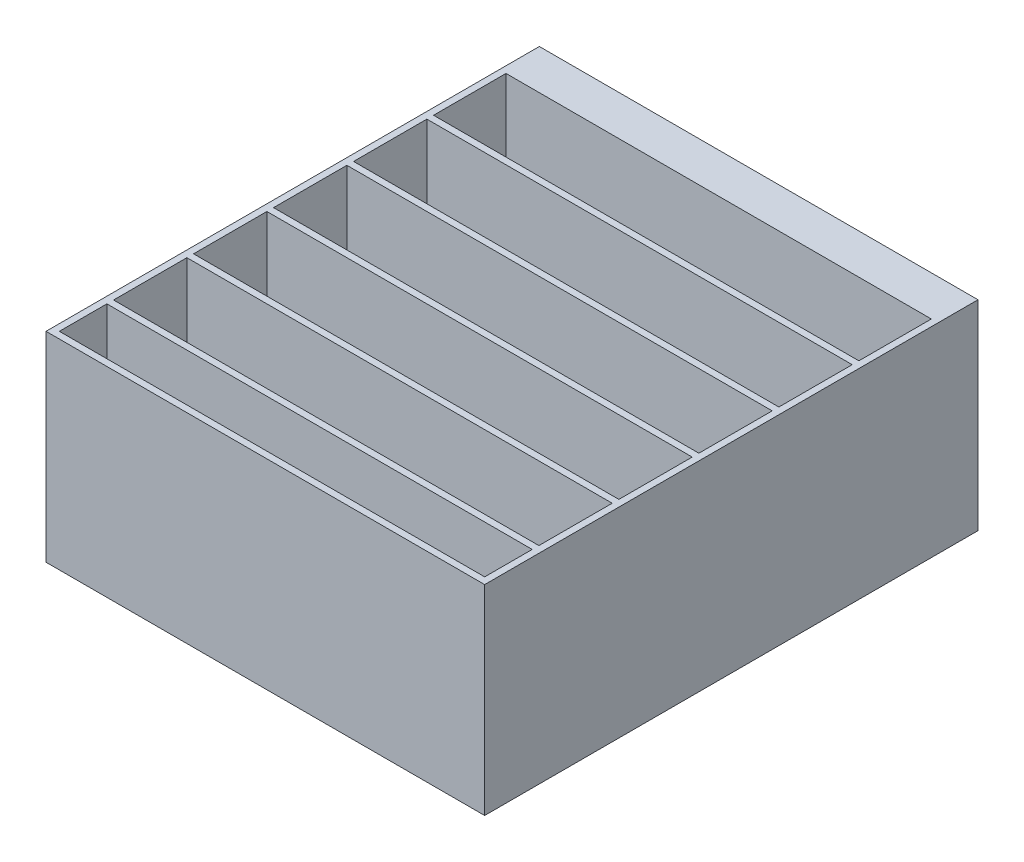
ISO-10303-21;
HEADER;
FILE_DESCRIPTION(('STEP AP214'),'2;1');
FILE_NAME('part.step','',(''),(''),'','','');
FILE_SCHEMA(('AUTOMOTIVE_DESIGN { 1 0 10303 214 1 1 1 1 }'));
ENDSEC;
DATA;
#1=APPLICATION_CONTEXT('core data for automotive mechanical design processes');
#2=APPLICATION_PROTOCOL_DEFINITION('international standard','automotive_design',2000,#1);
#3=PRODUCT_CONTEXT('',#1,'mechanical');
#4=PRODUCT('Part','Part','',(#3));
#5=PRODUCT_RELATED_PRODUCT_CATEGORY('part','',(#4));
#6=PRODUCT_DEFINITION_FORMATION('','',#4);
#7=PRODUCT_DEFINITION_CONTEXT('part definition',#1,'design');
#8=PRODUCT_DEFINITION('design','',#6,#7);
#9=PRODUCT_DEFINITION_SHAPE('','',#8);
#10=(LENGTH_UNIT() NAMED_UNIT(*) SI_UNIT(.MILLI.,.METRE.));
#11=(NAMED_UNIT(*) PLANE_ANGLE_UNIT() SI_UNIT($,.RADIAN.));
#12=(NAMED_UNIT(*) SI_UNIT($,.STERADIAN.) SOLID_ANGLE_UNIT());
#13=UNCERTAINTY_MEASURE_WITH_UNIT(LENGTH_MEASURE(1.E-05),#10,'distance_accuracy_value','');
#14=(GEOMETRIC_REPRESENTATION_CONTEXT(3) GLOBAL_UNCERTAINTY_ASSIGNED_CONTEXT((#13)) GLOBAL_UNIT_ASSIGNED_CONTEXT((#10,
#11,#12)) REPRESENTATION_CONTEXT('',''));
#15=CARTESIAN_POINT('',(0.,0.,0.));
#16=DIRECTION('',(0.,0.,1.));
#17=DIRECTION('',(1.,0.,0.));
#18=AXIS2_PLACEMENT_3D('',#15,#16,#17);
#19=CARTESIAN_POINT('',(-103.678343949045,-66.7595541401274,30.));
#20=DIRECTION('',(-1.,0.,0.));
#21=DIRECTION('',(0.,0.,1.));
#22=AXIS2_PLACEMENT_3D('',#19,#20,#21);
#23=PLANE('',#22);
#24=DIRECTION('',(0.,0.,1.));
#25=VECTOR('',#24,1.);
#26=CARTESIAN_POINT('',(-103.678343949045,-66.7595541401274,30.));
#27=LINE('',#26,#25);
#28=CARTESIAN_POINT('',(-103.678343949045,-66.7595541401274,329.339910945855));
#29=VERTEX_POINT('',#28);
#30=CARTESIAN_POINT('',(-103.678343949045,-66.7595541401274,365.));
#31=VERTEX_POINT('',#30);
#32=EDGE_CURVE('E285',#29,#31,#27,.T.);
#33=ORIENTED_EDGE('',*,*,#32,.F.);
#34=DIRECTION('',(0.,1.,0.));
#35=VECTOR('',#34,1.);
#36=CARTESIAN_POINT('',(-103.678343949045,-66.7595541401274,329.339910945855));
#37=LINE('',#36,#35);
#38=CARTESIAN_POINT('',(-103.678343949045,23.2404458598726,329.339910945854));
#39=VERTEX_POINT('',#38);
#40=EDGE_CURVE('E57',#29,#39,#37,.T.);
#41=ORIENTED_EDGE('',*,*,#40,.T.);
#42=DIRECTION('',(0.,0.,1.));
#43=VECTOR('',#42,1.);
#44=CARTESIAN_POINT('',(-103.678343949045,23.2404458598726,30.));
#45=LINE('',#44,#43);
#46=CARTESIAN_POINT('',(-103.678343949045,23.2404458598726,365.));
#47=VERTEX_POINT('',#46);
#48=EDGE_CURVE('E406',#39,#47,#45,.T.);
#49=ORIENTED_EDGE('',*,*,#48,.T.);
#50=DIRECTION('',(0.,1.,0.));
#51=VECTOR('',#50,1.);
#52=CARTESIAN_POINT('',(-103.678343949045,-66.7595541401274,365.));
#53=LINE('',#52,#51);
#54=EDGE_CURVE('E375',#31,#47,#53,.T.);
#55=ORIENTED_EDGE('',*,*,#54,.F.);
#56=EDGE_LOOP('',(#33,#41,#49,#55));
#57=FACE_BOUND('',#56,.T.);
#58=ADVANCED_FACE('F41',(#57),#23,.F.);
#59=CARTESIAN_POINT('',(215.321656050955,-66.7595541401274,30.));
#60=DIRECTION('',(1.,0.,0.));
#61=DIRECTION('',(0.,0.,-1.));
#62=AXIS2_PLACEMENT_3D('',#59,#60,#61);
#63=PLANE('',#62);
#64=DIRECTION('',(0.,0.,-1.));
#65=VECTOR('',#64,1.);
#66=CARTESIAN_POINT('',(215.321656050955,23.2404458598726,30.));
#67=LINE('',#66,#65);
#68=CARTESIAN_POINT('',(215.321656050955,23.2404458598726,365.));
#69=VERTEX_POINT('',#68);
#70=CARTESIAN_POINT('',(215.321656050955,23.2404458598726,329.339910945854));
#71=VERTEX_POINT('',#70);
#72=EDGE_CURVE('E393',#69,#71,#67,.T.);
#73=ORIENTED_EDGE('',*,*,#72,.T.);
#74=DIRECTION('',(0.,-1.,0.));
#75=VECTOR('',#74,1.);
#76=CARTESIAN_POINT('',(215.321656050955,-66.7595541401274,329.339910945855));
#77=LINE('',#76,#75);
#78=CARTESIAN_POINT('',(215.321656050955,-66.7595541401274,329.339910945855));
#79=VERTEX_POINT('',#78);
#80=EDGE_CURVE('E293',#71,#79,#77,.T.);
#81=ORIENTED_EDGE('',*,*,#80,.T.);
#82=DIRECTION('',(0.,0.,-1.));
#83=VECTOR('',#82,1.);
#84=CARTESIAN_POINT('',(215.321656050955,-66.7595541401274,30.));
#85=LINE('',#84,#83);
#86=CARTESIAN_POINT('',(215.321656050955,-66.7595541401274,365.));
#87=VERTEX_POINT('',#86);
#88=EDGE_CURVE('E410',#87,#79,#85,.T.);
#89=ORIENTED_EDGE('',*,*,#88,.F.);
#90=DIRECTION('',(0.,1.,0.));
#91=VECTOR('',#90,1.);
#92=CARTESIAN_POINT('',(215.321656050955,-66.7595541401274,365.));
#93=LINE('',#92,#91);
#94=EDGE_CURVE('E379',#87,#69,#93,.T.);
#95=ORIENTED_EDGE('',*,*,#94,.T.);
#96=EDGE_LOOP('',(#73,#81,#89,#95));
#97=FACE_BOUND('',#96,.T.);
#98=ADVANCED_FACE('F675',(#97),#63,.F.);
#99=CARTESIAN_POINT('',(0.,-66.7595541401274,0.));
#100=DIRECTION('',(0.,1.,0.));
#101=DIRECTION('',(0.,0.,1.));
#102=AXIS2_PLACEMENT_3D('',#99,#100,#101);
#103=PLANE('',#102);
#104=DIRECTION('',(1.,0.,0.));
#105=VECTOR('',#104,1.);
#106=CARTESIAN_POINT('',(0.,-66.7595541401274,329.339910945855));
#107=LINE('',#106,#105);
#108=EDGE_CURVE('E11',#29,#79,#107,.T.);
#109=ORIENTED_EDGE('',*,*,#108,.F.);
#110=ORIENTED_EDGE('',*,*,#32,.T.);
#111=DIRECTION('',(1.,0.,0.));
#112=VECTOR('',#111,1.);
#113=CARTESIAN_POINT('',(-103.678343949045,-66.7595541401274,365.));
#114=LINE('',#113,#112);
#115=EDGE_CURVE('E416',#31,#87,#114,.T.);
#116=ORIENTED_EDGE('',*,*,#115,.T.);
#117=ORIENTED_EDGE('',*,*,#88,.T.);
#118=EDGE_LOOP('',(#109,#110,#116,#117));
#119=FACE_BOUND('',#118,.T.);
#120=ADVANCED_FACE('F681',(#119),#103,.T.);
#121=CARTESIAN_POINT('',(-103.678343949045,23.2404458598726,209.339910945854));
#122=VERTEX_POINT('',#121);
#123=CARTESIAN_POINT('',(-103.678343949045,23.2404458598726,264.339910945855));
#124=VERTEX_POINT('',#123);
#125=EDGE_CURVE('E732',#122,#124,#45,.T.);
#126=ORIENTED_EDGE('',*,*,#125,.T.);
#127=DIRECTION('',(0.,-1.,0.));
#128=VECTOR('',#127,1.);
#129=CARTESIAN_POINT('',(-103.678343949045,-66.7595541401274,264.339910945855));
#130=LINE('',#129,#128);
#131=CARTESIAN_POINT('',(-103.678343949045,-66.7595541401274,264.339910945855));
#132=VERTEX_POINT('',#131);
#133=EDGE_CURVE('E562',#124,#132,#130,.T.);
#134=ORIENTED_EDGE('',*,*,#133,.T.);
#135=CARTESIAN_POINT('',(-103.678343949045,-66.7595541401274,209.339910945855));
#136=VERTEX_POINT('',#135);
#137=EDGE_CURVE('E284',#136,#132,#27,.T.);
#138=ORIENTED_EDGE('',*,*,#137,.F.);
#139=DIRECTION('',(0.,1.,0.));
#140=VECTOR('',#139,1.);
#141=CARTESIAN_POINT('',(-103.678343949045,-66.7595541401273,209.339910945854));
#142=LINE('',#141,#140);
#143=EDGE_CURVE('E550',#136,#122,#142,.T.);
#144=ORIENTED_EDGE('',*,*,#143,.T.);
#145=EDGE_LOOP('',(#126,#134,#138,#144));
#146=FACE_BOUND('',#145,.T.);
#147=ADVANCED_FACE('F677',(#146),#23,.F.);
#148=CARTESIAN_POINT('',(215.321656050955,-66.7595541401274,264.339910945855));
#149=VERTEX_POINT('',#148);
#150=CARTESIAN_POINT('',(215.321656050955,-66.7595541401273,209.339910945855));
#151=VERTEX_POINT('',#150);
#152=EDGE_CURVE('E651',#149,#151,#85,.T.);
#153=ORIENTED_EDGE('',*,*,#152,.F.);
#154=DIRECTION('',(0.,1.,0.));
#155=VECTOR('',#154,1.);
#156=CARTESIAN_POINT('',(215.321656050955,-66.7595541401274,264.339910945855));
#157=LINE('',#156,#155);
#158=CARTESIAN_POINT('',(215.321656050955,23.2404458598726,264.339910945855));
#159=VERTEX_POINT('',#158);
#160=EDGE_CURVE('E568',#149,#159,#157,.T.);
#161=ORIENTED_EDGE('',*,*,#160,.T.);
#162=CARTESIAN_POINT('',(215.321656050955,23.2404458598726,209.339910945854));
#163=VERTEX_POINT('',#162);
#164=EDGE_CURVE('E606',#159,#163,#67,.T.);
#165=ORIENTED_EDGE('',*,*,#164,.T.);
#166=DIRECTION('',(0.,-1.,0.));
#167=VECTOR('',#166,1.);
#168=CARTESIAN_POINT('',(215.321656050955,-66.7595541401273,209.339910945854));
#169=LINE('',#168,#167);
#170=EDGE_CURVE('E553',#163,#151,#169,.T.);
#171=ORIENTED_EDGE('',*,*,#170,.T.);
#172=EDGE_LOOP('',(#153,#161,#165,#171));
#173=FACE_BOUND('',#172,.T.);
#174=ADVANCED_FACE('F684',(#173),#63,.F.);
#175=DIRECTION('',(-1.,0.,0.));
#176=VECTOR('',#175,1.);
#177=CARTESIAN_POINT('',(0.,-66.7595541401274,264.339910945855));
#178=LINE('',#177,#176);
#179=EDGE_CURVE('E299',#149,#132,#178,.T.);
#180=ORIENTED_EDGE('',*,*,#179,.F.);
#181=ORIENTED_EDGE('',*,*,#152,.T.);
#182=DIRECTION('',(1.,0.,0.));
#183=VECTOR('',#182,1.);
#184=CARTESIAN_POINT('',(0.,-66.7595541401274,209.339910945855));
#185=LINE('',#184,#183);
#186=EDGE_CURVE('E310',#136,#151,#185,.T.);
#187=ORIENTED_EDGE('',*,*,#186,.F.);
#188=ORIENTED_EDGE('',*,*,#137,.T.);
#189=EDGE_LOOP('',(#180,#181,#187,#188));
#190=FACE_BOUND('',#189,.T.);
#191=ADVANCED_FACE('F717',(#190),#103,.T.);
#192=CARTESIAN_POINT('',(-103.678343949045,23.2404458598726,149.339910945854));
#193=VERTEX_POINT('',#192);
#194=CARTESIAN_POINT('',(-103.678343949045,23.2404458598726,204.339910945854));
#195=VERTEX_POINT('',#194);
#196=EDGE_CURVE('E725',#193,#195,#45,.T.);
#197=ORIENTED_EDGE('',*,*,#196,.T.);
#198=DIRECTION('',(0.,-1.,0.));
#199=VECTOR('',#198,1.);
#200=CARTESIAN_POINT('',(-103.678343949045,-66.7595541401274,204.339910945854));
#201=LINE('',#200,#199);
#202=CARTESIAN_POINT('',(-103.678343949045,-66.7595541401274,204.339910945854));
#203=VERTEX_POINT('',#202);
#204=EDGE_CURVE('E541',#195,#203,#201,.T.);
#205=ORIENTED_EDGE('',*,*,#204,.T.);
#206=CARTESIAN_POINT('',(-103.678343949045,-66.7595541401274,149.339910945854));
#207=VERTEX_POINT('',#206);
#208=EDGE_CURVE('E739',#207,#203,#27,.T.);
#209=ORIENTED_EDGE('',*,*,#208,.F.);
#210=DIRECTION('',(0.,1.,0.));
#211=VECTOR('',#210,1.);
#212=CARTESIAN_POINT('',(-103.678343949045,-66.7595541401274,149.339910945854));
#213=LINE('',#212,#211);
#214=EDGE_CURVE('E529',#207,#193,#213,.T.);
#215=ORIENTED_EDGE('',*,*,#214,.T.);
#216=EDGE_LOOP('',(#197,#205,#209,#215));
#217=FACE_BOUND('',#216,.T.);
#218=ADVANCED_FACE('F689',(#217),#23,.F.);
#219=CARTESIAN_POINT('',(215.321656050955,-66.7595541401274,204.339910945854));
#220=VERTEX_POINT('',#219);
#221=CARTESIAN_POINT('',(215.321656050955,-66.7595541401274,149.339910945854));
#222=VERTEX_POINT('',#221);
#223=EDGE_CURVE('E647',#220,#222,#85,.T.);
#224=ORIENTED_EDGE('',*,*,#223,.F.);
#225=DIRECTION('',(0.,1.,0.));
#226=VECTOR('',#225,1.);
#227=CARTESIAN_POINT('',(215.321656050955,-66.7595541401274,204.339910945854));
#228=LINE('',#227,#226);
#229=CARTESIAN_POINT('',(215.321656050955,23.2404458598726,204.339910945854));
#230=VERTEX_POINT('',#229);
#231=EDGE_CURVE('E547',#220,#230,#228,.T.);
#232=ORIENTED_EDGE('',*,*,#231,.T.);
#233=CARTESIAN_POINT('',(215.321656050955,23.2404458598726,149.339910945854));
#234=VERTEX_POINT('',#233);
#235=EDGE_CURVE('E608',#230,#234,#67,.T.);
#236=ORIENTED_EDGE('',*,*,#235,.T.);
#237=DIRECTION('',(0.,-1.,0.));
#238=VECTOR('',#237,1.);
#239=CARTESIAN_POINT('',(215.321656050955,-66.7595541401274,149.339910945854));
#240=LINE('',#239,#238);
#241=EDGE_CURVE('E532',#234,#222,#240,.T.);
#242=ORIENTED_EDGE('',*,*,#241,.T.);
#243=EDGE_LOOP('',(#224,#232,#236,#242));
#244=FACE_BOUND('',#243,.T.);
#245=ADVANCED_FACE('F716',(#244),#63,.F.);
#246=DIRECTION('',(-1.,0.,0.));
#247=VECTOR('',#246,1.);
#248=CARTESIAN_POINT('',(0.,-66.7595541401274,204.339910945854));
#249=LINE('',#248,#247);
#250=EDGE_CURVE('E306',#220,#203,#249,.T.);
#251=ORIENTED_EDGE('',*,*,#250,.F.);
#252=ORIENTED_EDGE('',*,*,#223,.T.);
#253=DIRECTION('',(1.,0.,0.));
#254=VECTOR('',#253,1.);
#255=CARTESIAN_POINT('',(0.,-66.7595541401274,149.339910945854));
#256=LINE('',#255,#254);
#257=EDGE_CURVE('E318',#207,#222,#256,.T.);
#258=ORIENTED_EDGE('',*,*,#257,.F.);
#259=ORIENTED_EDGE('',*,*,#208,.T.);
#260=EDGE_LOOP('',(#251,#252,#258,#259));
#261=FACE_BOUND('',#260,.T.);
#262=ADVANCED_FACE('F709',(#261),#103,.T.);
#263=CARTESIAN_POINT('',(-103.678343949045,23.2404458598726,89.3399109458545));
#264=VERTEX_POINT('',#263);
#265=CARTESIAN_POINT('',(-103.678343949045,23.2404458598726,144.339910945854));
#266=VERTEX_POINT('',#265);
#267=EDGE_CURVE('E405',#264,#266,#45,.T.);
#268=ORIENTED_EDGE('',*,*,#267,.T.);
#269=DIRECTION('',(0.,-1.,0.));
#270=VECTOR('',#269,1.);
#271=CARTESIAN_POINT('',(-103.678343949045,-66.7595541401274,144.339910945854));
#272=LINE('',#271,#270);
#273=CARTESIAN_POINT('',(-103.678343949045,-66.7595541401274,144.339910945854));
#274=VERTEX_POINT('',#273);
#275=EDGE_CURVE('E520',#266,#274,#272,.T.);
#276=ORIENTED_EDGE('',*,*,#275,.T.);
#277=CARTESIAN_POINT('',(-103.678343949045,-66.7595541401274,89.3399109458545));
#278=VERTEX_POINT('',#277);
#279=EDGE_CURVE('E423',#278,#274,#27,.T.);
#280=ORIENTED_EDGE('',*,*,#279,.F.);
#281=DIRECTION('',(0.,1.,0.));
#282=VECTOR('',#281,1.);
#283=CARTESIAN_POINT('',(-103.678343949045,-66.7595541401274,89.3399109458545));
#284=LINE('',#283,#282);
#285=EDGE_CURVE('E508',#278,#264,#284,.T.);
#286=ORIENTED_EDGE('',*,*,#285,.T.);
#287=EDGE_LOOP('',(#268,#276,#280,#286));
#288=FACE_BOUND('',#287,.T.);
#289=ADVANCED_FACE('F702',(#288),#23,.F.);
#290=CARTESIAN_POINT('',(215.321656050955,-66.7595541401274,144.339910945854));
#291=VERTEX_POINT('',#290);
#292=CARTESIAN_POINT('',(215.321656050955,-66.7595541401273,89.3399109458545));
#293=VERTEX_POINT('',#292);
#294=EDGE_CURVE('E645',#291,#293,#85,.T.);
#295=ORIENTED_EDGE('',*,*,#294,.F.);
#296=DIRECTION('',(0.,1.,0.));
#297=VECTOR('',#296,1.);
#298=CARTESIAN_POINT('',(215.321656050955,-66.7595541401274,144.339910945854));
#299=LINE('',#298,#297);
#300=CARTESIAN_POINT('',(215.321656050955,23.2404458598726,144.339910945854));
#301=VERTEX_POINT('',#300);
#302=EDGE_CURVE('E526',#291,#301,#299,.T.);
#303=ORIENTED_EDGE('',*,*,#302,.T.);
#304=CARTESIAN_POINT('',(215.321656050955,23.2404458598726,89.3399109458545));
#305=VERTEX_POINT('',#304);
#306=EDGE_CURVE('E613',#301,#305,#67,.T.);
#307=ORIENTED_EDGE('',*,*,#306,.T.);
#308=DIRECTION('',(0.,-1.,0.));
#309=VECTOR('',#308,1.);
#310=CARTESIAN_POINT('',(215.321656050955,-66.7595541401274,89.3399109458545));
#311=LINE('',#310,#309);
#312=EDGE_CURVE('E511',#305,#293,#311,.T.);
#313=ORIENTED_EDGE('',*,*,#312,.T.);
#314=EDGE_LOOP('',(#295,#303,#307,#313));
#315=FACE_BOUND('',#314,.T.);
#316=ADVANCED_FACE('F707',(#315),#63,.F.);
#317=DIRECTION('',(-1.,0.,0.));
#318=VECTOR('',#317,1.);
#319=CARTESIAN_POINT('',(0.,-66.7595541401274,144.339910945854));
#320=LINE('',#319,#318);
#321=EDGE_CURVE('E314',#291,#274,#320,.T.);
#322=ORIENTED_EDGE('',*,*,#321,.F.);
#323=ORIENTED_EDGE('',*,*,#294,.T.);
#324=DIRECTION('',(1.,0.,0.));
#325=VECTOR('',#324,1.);
#326=CARTESIAN_POINT('',(0.,-66.7595541401274,89.3399109458545));
#327=LINE('',#326,#325);
#328=EDGE_CURVE('E326',#278,#293,#327,.T.);
#329=ORIENTED_EDGE('',*,*,#328,.F.);
#330=ORIENTED_EDGE('',*,*,#279,.T.);
#331=EDGE_LOOP('',(#322,#323,#329,#330));
#332=FACE_BOUND('',#331,.T.);
#333=ADVANCED_FACE('F701',(#332),#103,.T.);
#334=CARTESIAN_POINT('',(-103.678343949045,23.2404458598726,30.));
#335=VERTEX_POINT('',#334);
#336=CARTESIAN_POINT('',(-103.678343949045,23.2404458598726,84.3399109458545));
#337=VERTEX_POINT('',#336);
#338=EDGE_CURVE('E402',#335,#337,#45,.T.);
#339=ORIENTED_EDGE('',*,*,#338,.T.);
#340=DIRECTION('',(0.,-1.,0.));
#341=VECTOR('',#340,1.);
#342=CARTESIAN_POINT('',(-103.678343949045,-66.7595541401274,84.3399109458545));
#343=LINE('',#342,#341);
#344=CARTESIAN_POINT('',(-103.678343949045,-66.7595541401274,84.3399109458545));
#345=VERTEX_POINT('',#344);
#346=EDGE_CURVE('E490',#337,#345,#343,.T.);
#347=ORIENTED_EDGE('',*,*,#346,.T.);
#348=CARTESIAN_POINT('',(-103.678343949045,-66.7595541401274,30.));
#349=VERTEX_POINT('',#348);
#350=EDGE_CURVE('E419',#349,#345,#27,.T.);
#351=ORIENTED_EDGE('',*,*,#350,.F.);
#352=DIRECTION('',(0.,1.,0.));
#353=VECTOR('',#352,1.);
#354=CARTESIAN_POINT('',(-103.678343949045,-66.7595541401274,30.));
#355=LINE('',#354,#353);
#356=EDGE_CURVE('E363',#349,#335,#355,.T.);
#357=ORIENTED_EDGE('',*,*,#356,.T.);
#358=EDGE_LOOP('',(#339,#347,#351,#357));
#359=FACE_BOUND('',#358,.T.);
#360=ADVANCED_FACE('F638',(#359),#23,.F.);
#361=CARTESIAN_POINT('',(215.321656050955,-66.7595541401274,84.3399109458545));
#362=VERTEX_POINT('',#361);
#363=CARTESIAN_POINT('',(215.321656050955,-66.7595541401274,30.));
#364=VERTEX_POINT('',#363);
#365=EDGE_CURVE('E415',#362,#364,#85,.T.);
#366=ORIENTED_EDGE('',*,*,#365,.F.);
#367=DIRECTION('',(0.,1.,0.));
#368=VECTOR('',#367,1.);
#369=CARTESIAN_POINT('',(215.321656050955,-66.7595541401274,84.3399109458545));
#370=LINE('',#369,#368);
#371=CARTESIAN_POINT('',(215.321656050955,23.2404458598726,84.3399109458545));
#372=VERTEX_POINT('',#371);
#373=EDGE_CURVE('E505',#362,#372,#370,.T.);
#374=ORIENTED_EDGE('',*,*,#373,.T.);
#375=CARTESIAN_POINT('',(215.321656050955,23.2404458598726,30.));
#376=VERTEX_POINT('',#375);
#377=EDGE_CURVE('E397',#372,#376,#67,.T.);
#378=ORIENTED_EDGE('',*,*,#377,.T.);
#379=DIRECTION('',(0.,1.,0.));
#380=VECTOR('',#379,1.);
#381=CARTESIAN_POINT('',(215.321656050955,-66.7595541401274,30.));
#382=LINE('',#381,#380);
#383=EDGE_CURVE('E383',#364,#376,#382,.T.);
#384=ORIENTED_EDGE('',*,*,#383,.F.);
#385=EDGE_LOOP('',(#366,#374,#378,#384));
#386=FACE_BOUND('',#385,.T.);
#387=ADVANCED_FACE('F626',(#386),#63,.F.);
#388=DIRECTION('',(-1.,0.,0.));
#389=VECTOR('',#388,1.);
#390=CARTESIAN_POINT('',(0.,-66.7595541401274,84.3399109458545));
#391=LINE('',#390,#389);
#392=EDGE_CURVE('E322',#362,#345,#391,.T.);
#393=ORIENTED_EDGE('',*,*,#392,.F.);
#394=ORIENTED_EDGE('',*,*,#365,.T.);
#395=DIRECTION('',(-1.,0.,0.));
#396=VECTOR('',#395,1.);
#397=CARTESIAN_POINT('',(-103.678343949045,-66.7595541401274,30.));
#398=LINE('',#397,#396);
#399=EDGE_CURVE('E380',#364,#349,#398,.T.);
#400=ORIENTED_EDGE('',*,*,#399,.T.);
#401=ORIENTED_EDGE('',*,*,#350,.T.);
#402=EDGE_LOOP('',(#393,#394,#400,#401));
#403=FACE_BOUND('',#402,.T.);
#404=ADVANCED_FACE('F643',(#403),#103,.T.);
#405=CARTESIAN_POINT('',(-108.678343949045,23.2404458598726,370.));
#406=DIRECTION('',(1.,0.,0.));
#407=DIRECTION('',(0.,1.,0.));
#408=AXIS2_PLACEMENT_3D('',#405,#406,#407);
#409=PLANE('',#408);
#410=DIRECTION('',(0.,0.,-1.));
#411=VECTOR('',#410,1.);
#412=CARTESIAN_POINT('',(-108.678343949045,23.2404458598726,370.));
#413=LINE('',#412,#411);
#414=CARTESIAN_POINT('',(-108.678343949045,23.2404458598726,370.));
#415=VERTEX_POINT('',#414);
#416=CARTESIAN_POINT('',(-108.678343949045,23.2404458598726,0.));
#417=VERTEX_POINT('',#416);
#418=EDGE_CURVE('E341',#415,#417,#413,.T.);
#419=ORIENTED_EDGE('',*,*,#418,.T.);
#420=DIRECTION('',(0.,-1.,0.));
#421=VECTOR('',#420,1.);
#422=CARTESIAN_POINT('',(-108.678343949045,23.2404458598726,0.));
#423=LINE('',#422,#421);
#424=CARTESIAN_POINT('',(-108.678343949045,-126.759554140127,0.));
#425=VERTEX_POINT('',#424);
#426=EDGE_CURVE('E359',#417,#425,#423,.T.);
#427=ORIENTED_EDGE('',*,*,#426,.T.);
#428=DIRECTION('',(0.,0.,-1.));
#429=VECTOR('',#428,1.);
#430=CARTESIAN_POINT('',(-108.678343949045,-126.759554140127,370.));
#431=LINE('',#430,#429);
#432=CARTESIAN_POINT('',(-108.678343949045,-126.759554140127,370.));
#433=VERTEX_POINT('',#432);
#434=EDGE_CURVE('E330',#433,#425,#431,.T.);
#435=ORIENTED_EDGE('',*,*,#434,.F.);
#436=DIRECTION('',(0.,-1.,0.));
#437=VECTOR('',#436,1.);
#438=CARTESIAN_POINT('',(-108.678343949045,23.2404458598726,370.));
#439=LINE('',#438,#437);
#440=EDGE_CURVE('E349',#415,#433,#439,.T.);
#441=ORIENTED_EDGE('',*,*,#440,.F.);
#442=EDGE_LOOP('',(#419,#427,#435,#441));
#443=FACE_BOUND('',#442,.T.);
#444=ADVANCED_FACE('F43',(#443),#409,.F.);
#445=CARTESIAN_POINT('',(-108.678343949045,-126.759554140127,370.));
#446=DIRECTION('',(0.,1.,0.));
#447=DIRECTION('',(0.,0.,1.));
#448=AXIS2_PLACEMENT_3D('',#445,#446,#447);
#449=PLANE('',#448);
#450=DIRECTION('',(1.,0.,0.));
#451=VECTOR('',#450,1.);
#452=CARTESIAN_POINT('',(-108.678343949045,-126.759554140127,0.));
#453=LINE('',#452,#451);
#454=CARTESIAN_POINT('',(-48.6783439490446,-126.759554140127,0.));
#455=VERTEX_POINT('',#454);
#456=EDGE_CURVE('E354',#425,#455,#453,.T.);
#457=ORIENTED_EDGE('',*,*,#456,.T.);
#458=DIRECTION('',(0.,0.,-1.));
#459=VECTOR('',#458,1.);
#460=CARTESIAN_POINT('',(-48.6783439490446,-126.759554140127,10.7137914621154));
#461=LINE('',#460,#459);
#462=CARTESIAN_POINT('',(-48.6783439490446,-126.759554140127,10.7137914621154));
#463=VERTEX_POINT('',#462);
#464=EDGE_CURVE('E447',#463,#455,#461,.T.);
#465=ORIENTED_EDGE('',*,*,#464,.F.);
#466=DIRECTION('',(-1.,0.,0.));
#467=VECTOR('',#466,1.);
#468=CARTESIAN_POINT('',(-48.6783439490446,-126.759554140127,10.7137914621154));
#469=LINE('',#468,#467);
#470=CARTESIAN_POINT('',(160.321656050955,-126.759554140127,10.7137914621154));
#471=VERTEX_POINT('',#470);
#472=EDGE_CURVE('E438',#471,#463,#469,.T.);
#473=ORIENTED_EDGE('',*,*,#472,.F.);
#474=DIRECTION('',(0.,0.,1.));
#475=VECTOR('',#474,1.);
#476=CARTESIAN_POINT('',(160.321656050955,-126.759554140127,10.7137914621154));
#477=LINE('',#476,#475);
#478=CARTESIAN_POINT('',(160.321656050955,-126.759554140127,0.));
#479=VERTEX_POINT('',#478);
#480=EDGE_CURVE('E443',#479,#471,#477,.T.);
#481=ORIENTED_EDGE('',*,*,#480,.F.);
#482=CARTESIAN_POINT('',(220.321656050955,-126.759554140127,0.));
#483=VERTEX_POINT('',#482);
#484=EDGE_CURVE('E358',#479,#483,#453,.T.);
#485=ORIENTED_EDGE('',*,*,#484,.T.);
#486=DIRECTION('',(0.,0.,-1.));
#487=VECTOR('',#486,1.);
#488=CARTESIAN_POINT('',(220.321656050955,-126.759554140127,370.));
#489=LINE('',#488,#487);
#490=CARTESIAN_POINT('',(220.321656050955,-126.759554140127,370.));
#491=VERTEX_POINT('',#490);
#492=EDGE_CURVE('E334',#491,#483,#489,.T.);
#493=ORIENTED_EDGE('',*,*,#492,.F.);
#494=DIRECTION('',(1.,0.,0.));
#495=VECTOR('',#494,1.);
#496=CARTESIAN_POINT('',(-108.678343949045,-126.759554140127,370.));
#497=LINE('',#496,#495);
#498=EDGE_CURVE('E369',#433,#491,#497,.T.);
#499=ORIENTED_EDGE('',*,*,#498,.F.);
#500=ORIENTED_EDGE('',*,*,#434,.T.);
#501=EDGE_LOOP('',(#457,#465,#473,#481,#485,#493,#499,#500));
#502=FACE_BOUND('',#501,.T.);
#503=ADVANCED_FACE('F785',(#502),#449,.F.);
#504=CARTESIAN_POINT('',(220.321656050955,23.2404458598726,370.));
#505=DIRECTION('',(-1.,0.,0.));
#506=DIRECTION('',(0.,-1.,0.));
#507=AXIS2_PLACEMENT_3D('',#504,#505,#506);
#508=PLANE('',#507);
#509=DIRECTION('',(0.,1.,0.));
#510=VECTOR('',#509,1.);
#511=CARTESIAN_POINT('',(220.321656050955,23.2404458598726,0.));
#512=LINE('',#511,#510);
#513=CARTESIAN_POINT('',(220.321656050955,23.2404458598726,0.));
#514=VERTEX_POINT('',#513);
#515=EDGE_CURVE('E350',#483,#514,#512,.T.);
#516=ORIENTED_EDGE('',*,*,#515,.T.);
#517=DIRECTION('',(0.,0.,-1.));
#518=VECTOR('',#517,1.);
#519=CARTESIAN_POINT('',(220.321656050955,23.2404458598726,370.));
#520=LINE('',#519,#518);
#521=CARTESIAN_POINT('',(220.321656050955,23.2404458598726,370.));
#522=VERTEX_POINT('',#521);
#523=EDGE_CURVE('E338',#522,#514,#520,.T.);
#524=ORIENTED_EDGE('',*,*,#523,.F.);
#525=DIRECTION('',(0.,1.,0.));
#526=VECTOR('',#525,1.);
#527=CARTESIAN_POINT('',(220.321656050955,23.2404458598726,370.));
#528=LINE('',#527,#526);
#529=EDGE_CURVE('E366',#491,#522,#528,.T.);
#530=ORIENTED_EDGE('',*,*,#529,.F.);
#531=ORIENTED_EDGE('',*,*,#492,.T.);
#532=EDGE_LOOP('',(#516,#524,#530,#531));
#533=FACE_BOUND('',#532,.T.);
#534=ADVANCED_FACE('F790',(#533),#508,.F.);
#535=CARTESIAN_POINT('',(-108.678343949045,23.2404458598726,370.));
#536=DIRECTION('',(0.,-1.,0.));
#537=DIRECTION('',(0.,0.,-1.));
#538=AXIS2_PLACEMENT_3D('',#535,#536,#537);
#539=PLANE('',#538);
#540=DIRECTION('',(-1.,0.,0.));
#541=VECTOR('',#540,1.);
#542=CARTESIAN_POINT('',(220.321656050955,23.2404458598726,329.339910945855));
#543=LINE('',#542,#541);
#544=EDGE_CURVE('E593',#71,#39,#543,.T.);
#545=ORIENTED_EDGE('',*,*,#544,.F.);
#546=ORIENTED_EDGE('',*,*,#72,.F.);
#547=DIRECTION('',(1.,0.,0.));
#548=VECTOR('',#547,1.);
#549=CARTESIAN_POINT('',(-103.678343949045,23.2404458598726,365.));
#550=LINE('',#549,#548);
#551=EDGE_CURVE('E398',#47,#69,#550,.T.);
#552=ORIENTED_EDGE('',*,*,#551,.F.);
#553=ORIENTED_EDGE('',*,*,#48,.F.);
#554=EDGE_LOOP('',(#545,#546,#552,#553));
#555=FACE_BOUND('',#554,.T.);
#556=DIRECTION('',(-1.,0.,0.));
#557=VECTOR('',#556,1.);
#558=CARTESIAN_POINT('',(220.321656050955,23.2404458598726,324.339910945855));
#559=LINE('',#558,#557);
#560=CARTESIAN_POINT('',(215.321656050955,23.2404458598726,324.339910945854));
#561=VERTEX_POINT('',#560);
#562=CARTESIAN_POINT('',(-103.678343949045,23.2404458598726,324.339910945854));
#563=VERTEX_POINT('',#562);
#564=EDGE_CURVE('E592',#561,#563,#559,.T.);
#565=ORIENTED_EDGE('',*,*,#564,.T.);
#566=CARTESIAN_POINT('',(-103.678343949045,23.2404458598726,269.339910945855));
#567=VERTEX_POINT('',#566);
#568=EDGE_CURVE('E65',#567,#563,#45,.T.);
#569=ORIENTED_EDGE('',*,*,#568,.F.);
#570=DIRECTION('',(-1.,0.,0.));
#571=VECTOR('',#570,1.);
#572=CARTESIAN_POINT('',(220.321656050955,23.2404458598726,269.339910945855));
#573=LINE('',#572,#571);
#574=CARTESIAN_POINT('',(215.321656050955,23.2404458598726,269.339910945855));
#575=VERTEX_POINT('',#574);
#576=EDGE_CURVE('E579',#575,#567,#573,.T.);
#577=ORIENTED_EDGE('',*,*,#576,.F.);
#578=EDGE_CURVE('E396',#561,#575,#67,.T.);
#579=ORIENTED_EDGE('',*,*,#578,.F.);
#580=EDGE_LOOP('',(#565,#569,#577,#579));
#581=FACE_BOUND('',#580,.T.);
#582=DIRECTION('',(-1.,0.,0.));
#583=VECTOR('',#582,1.);
#584=CARTESIAN_POINT('',(220.321656050955,23.2404458598726,264.339910945855));
#585=LINE('',#584,#583);
#586=EDGE_CURVE('E578',#159,#124,#585,.T.);
#587=ORIENTED_EDGE('',*,*,#586,.T.);
#588=ORIENTED_EDGE('',*,*,#125,.F.);
#589=DIRECTION('',(-1.,0.,0.));
#590=VECTOR('',#589,1.);
#591=CARTESIAN_POINT('',(220.321656050955,23.2404458598726,209.339910945854));
#592=LINE('',#591,#590);
#593=EDGE_CURVE('E558',#163,#122,#592,.T.);
#594=ORIENTED_EDGE('',*,*,#593,.F.);
#595=ORIENTED_EDGE('',*,*,#164,.F.);
#596=EDGE_LOOP('',(#587,#588,#594,#595));
#597=FACE_BOUND('',#596,.T.);
#598=DIRECTION('',(-1.,0.,0.));
#599=VECTOR('',#598,1.);
#600=CARTESIAN_POINT('',(-108.678343949045,23.2404458598726,0.));
#601=LINE('',#600,#599);
#602=EDGE_CURVE('E345',#514,#417,#601,.T.);
#603=ORIENTED_EDGE('',*,*,#602,.T.);
#604=ORIENTED_EDGE('',*,*,#418,.F.);
#605=DIRECTION('',(-1.,0.,0.));
#606=VECTOR('',#605,1.);
#607=CARTESIAN_POINT('',(-108.678343949045,23.2404458598726,370.));
#608=LINE('',#607,#606);
#609=EDGE_CURVE('E344',#522,#415,#608,.T.);
#610=ORIENTED_EDGE('',*,*,#609,.F.);
#611=ORIENTED_EDGE('',*,*,#523,.T.);
#612=EDGE_LOOP('',(#603,#604,#610,#611));
#613=FACE_BOUND('',#612,.T.);
#614=DIRECTION('',(-1.,0.,0.));
#615=VECTOR('',#614,1.);
#616=CARTESIAN_POINT('',(220.321656050955,23.2404458598726,144.339910945854));
#617=LINE('',#616,#615);
#618=EDGE_CURVE('E536',#301,#266,#617,.T.);
#619=ORIENTED_EDGE('',*,*,#618,.T.);
#620=ORIENTED_EDGE('',*,*,#267,.F.);
#621=DIRECTION('',(-1.,0.,0.));
#622=VECTOR('',#621,1.);
#623=CARTESIAN_POINT('',(220.321656050955,23.2404458598726,89.3399109458545));
#624=LINE('',#623,#622);
#625=EDGE_CURVE('E516',#305,#264,#624,.T.);
#626=ORIENTED_EDGE('',*,*,#625,.F.);
#627=ORIENTED_EDGE('',*,*,#306,.F.);
#628=EDGE_LOOP('',(#619,#620,#626,#627));
#629=FACE_BOUND('',#628,.T.);
#630=DIRECTION('',(-1.,0.,0.));
#631=VECTOR('',#630,1.);
#632=CARTESIAN_POINT('',(220.321656050955,23.2404458598726,84.3399109458545));
#633=LINE('',#632,#631);
#634=EDGE_CURVE('E515',#372,#337,#633,.T.);
#635=ORIENTED_EDGE('',*,*,#634,.T.);
#636=ORIENTED_EDGE('',*,*,#338,.F.);
#637=DIRECTION('',(-1.,0.,0.));
#638=VECTOR('',#637,1.);
#639=CARTESIAN_POINT('',(-103.678343949045,23.2404458598726,30.));
#640=LINE('',#639,#638);
#641=EDGE_CURVE('E389',#376,#335,#640,.T.);
#642=ORIENTED_EDGE('',*,*,#641,.F.);
#643=ORIENTED_EDGE('',*,*,#377,.F.);
#644=EDGE_LOOP('',(#635,#636,#642,#643));
#645=FACE_BOUND('',#644,.T.);
#646=DIRECTION('',(-1.,0.,0.));
#647=VECTOR('',#646,1.);
#648=CARTESIAN_POINT('',(220.321656050955,23.2404458598726,204.339910945854));
#649=LINE('',#648,#647);
#650=EDGE_CURVE('E557',#230,#195,#649,.T.);
#651=ORIENTED_EDGE('',*,*,#650,.T.);
#652=ORIENTED_EDGE('',*,*,#196,.F.);
#653=DIRECTION('',(-1.,0.,0.));
#654=VECTOR('',#653,1.);
#655=CARTESIAN_POINT('',(220.321656050955,23.2404458598726,149.339910945854));
#656=LINE('',#655,#654);
#657=EDGE_CURVE('E537',#234,#193,#656,.T.);
#658=ORIENTED_EDGE('',*,*,#657,.F.);
#659=ORIENTED_EDGE('',*,*,#235,.F.);
#660=EDGE_LOOP('',(#651,#652,#658,#659));
#661=FACE_BOUND('',#660,.T.);
#662=ADVANCED_FACE('F600',(#555,#581,#597,#613,#629,#645,#661),#539,.F.);
#663=CARTESIAN_POINT('',(0.,0.,370.));
#664=DIRECTION('',(0.,0.,1.));
#665=DIRECTION('',(1.,0.,0.));
#666=AXIS2_PLACEMENT_3D('',#663,#664,#665);
#667=PLANE('',#666);
#668=ORIENTED_EDGE('',*,*,#440,.T.);
#669=ORIENTED_EDGE('',*,*,#498,.T.);
#670=ORIENTED_EDGE('',*,*,#529,.T.);
#671=ORIENTED_EDGE('',*,*,#609,.T.);
#672=EDGE_LOOP('',(#668,#669,#670,#671));
#673=FACE_BOUND('',#672,.T.);
#674=ADVANCED_FACE('F697',(#673),#667,.T.);
#675=CARTESIAN_POINT('',(0.,0.,0.));
#676=DIRECTION('',(0.,0.,1.));
#677=DIRECTION('',(1.,0.,0.));
#678=AXIS2_PLACEMENT_3D('',#675,#676,#677);
#679=PLANE('',#678);
#680=DIRECTION('',(1.,0.,0.));
#681=VECTOR('',#680,1.);
#682=CARTESIAN_POINT('',(-48.6783439490446,-96.7595541401274,0.));
#683=LINE('',#682,#681);
#684=CARTESIAN_POINT('',(-48.6783439490446,-96.7595541401274,0.));
#685=VERTEX_POINT('',#684);
#686=CARTESIAN_POINT('',(160.321656050955,-96.7595541401274,0.));
#687=VERTEX_POINT('',#686);
#688=EDGE_CURVE('E459',#685,#687,#683,.T.);
#689=ORIENTED_EDGE('',*,*,#688,.F.);
#690=DIRECTION('',(0.,-1.,0.));
#691=VECTOR('',#690,1.);
#692=CARTESIAN_POINT('',(-48.6783439490446,-96.7595541401274,0.));
#693=LINE('',#692,#691);
#694=EDGE_CURVE('E424',#685,#455,#693,.T.);
#695=ORIENTED_EDGE('',*,*,#694,.T.);
#696=ORIENTED_EDGE('',*,*,#456,.F.);
#697=ORIENTED_EDGE('',*,*,#426,.F.);
#698=ORIENTED_EDGE('',*,*,#602,.F.);
#699=ORIENTED_EDGE('',*,*,#515,.F.);
#700=ORIENTED_EDGE('',*,*,#484,.F.);
#701=DIRECTION('',(0.,-1.,0.));
#702=VECTOR('',#701,1.);
#703=CARTESIAN_POINT('',(160.321656050955,-96.7595541401274,0.));
#704=LINE('',#703,#702);
#705=EDGE_CURVE('E428',#687,#479,#704,.T.);
#706=ORIENTED_EDGE('',*,*,#705,.F.);
#707=EDGE_LOOP('',(#689,#695,#696,#697,#698,#699,#700,#706));
#708=FACE_BOUND('',#707,.T.);
#709=ADVANCED_FACE('F691',(#708),#679,.F.);
#710=ORIENTED_EDGE('',*,*,#568,.T.);
#711=DIRECTION('',(0.,-1.,0.));
#712=VECTOR('',#711,1.);
#713=CARTESIAN_POINT('',(-103.678343949045,-66.7595541401274,324.339910945855));
#714=LINE('',#713,#712);
#715=CARTESIAN_POINT('',(-103.678343949045,-66.7595541401274,324.339910945855));
#716=VERTEX_POINT('',#715);
#717=EDGE_CURVE('E287',#563,#716,#714,.T.);
#718=ORIENTED_EDGE('',*,*,#717,.T.);
#719=CARTESIAN_POINT('',(-103.678343949045,-66.7595541401274,269.339910945855));
#720=VERTEX_POINT('',#719);
#721=EDGE_CURVE('E276',#720,#716,#27,.T.);
#722=ORIENTED_EDGE('',*,*,#721,.F.);
#723=DIRECTION('',(0.,1.,0.));
#724=VECTOR('',#723,1.);
#725=CARTESIAN_POINT('',(-103.678343949045,-66.7595541401274,269.339910945855));
#726=LINE('',#725,#724);
#727=EDGE_CURVE('E571',#720,#567,#726,.T.);
#728=ORIENTED_EDGE('',*,*,#727,.T.);
#729=EDGE_LOOP('',(#710,#718,#722,#728));
#730=FACE_BOUND('',#729,.T.);
#731=ADVANCED_FACE('F288',(#730),#23,.F.);
#732=CARTESIAN_POINT('',(-103.678343949045,-66.7595541401274,30.));
#733=DIRECTION('',(0.,0.,-1.));
#734=DIRECTION('',(-1.,0.,0.));
#735=AXIS2_PLACEMENT_3D('',#732,#733,#734);
#736=PLANE('',#735);
#737=ORIENTED_EDGE('',*,*,#641,.T.);
#738=ORIENTED_EDGE('',*,*,#356,.F.);
#739=ORIENTED_EDGE('',*,*,#399,.F.);
#740=ORIENTED_EDGE('',*,*,#383,.T.);
#741=EDGE_LOOP('',(#737,#738,#739,#740));
#742=FACE_BOUND('',#741,.T.);
#743=ADVANCED_FACE('F633',(#742),#736,.F.);
#744=CARTESIAN_POINT('',(215.321656050955,-66.7595541401274,324.339910945855));
#745=VERTEX_POINT('',#744);
#746=CARTESIAN_POINT('',(215.321656050955,-66.7595541401273,269.339910945855));
#747=VERTEX_POINT('',#746);
#748=EDGE_CURVE('E414',#745,#747,#85,.T.);
#749=ORIENTED_EDGE('',*,*,#748,.F.);
#750=DIRECTION('',(0.,1.,0.));
#751=VECTOR('',#750,1.);
#752=CARTESIAN_POINT('',(215.321656050955,-66.7595541401274,324.339910945855));
#753=LINE('',#752,#751);
#754=EDGE_CURVE('E294',#745,#561,#753,.T.);
#755=ORIENTED_EDGE('',*,*,#754,.T.);
#756=ORIENTED_EDGE('',*,*,#578,.T.);
#757=DIRECTION('',(0.,-1.,0.));
#758=VECTOR('',#757,1.);
#759=CARTESIAN_POINT('',(215.321656050955,-66.7595541401274,269.339910945855));
#760=LINE('',#759,#758);
#761=EDGE_CURVE('E574',#575,#747,#760,.T.);
#762=ORIENTED_EDGE('',*,*,#761,.T.);
#763=EDGE_LOOP('',(#749,#755,#756,#762));
#764=FACE_BOUND('',#763,.T.);
#765=ADVANCED_FACE('F658',(#764),#63,.F.);
#766=CARTESIAN_POINT('',(-103.678343949045,-66.7595541401274,365.));
#767=DIRECTION('',(0.,0.,1.));
#768=DIRECTION('',(1.,0.,0.));
#769=AXIS2_PLACEMENT_3D('',#766,#767,#768);
#770=PLANE('',#769);
#771=ORIENTED_EDGE('',*,*,#551,.T.);
#772=ORIENTED_EDGE('',*,*,#94,.F.);
#773=ORIENTED_EDGE('',*,*,#115,.F.);
#774=ORIENTED_EDGE('',*,*,#54,.T.);
#775=EDGE_LOOP('',(#771,#772,#773,#774));
#776=FACE_BOUND('',#775,.T.);
#777=ADVANCED_FACE('F763',(#776),#770,.F.);
#778=DIRECTION('',(-1.,0.,0.));
#779=VECTOR('',#778,1.);
#780=CARTESIAN_POINT('',(0.,-66.7595541401274,324.339910945855));
#781=LINE('',#780,#779);
#782=EDGE_CURVE('E50',#745,#716,#781,.T.);
#783=ORIENTED_EDGE('',*,*,#782,.F.);
#784=ORIENTED_EDGE('',*,*,#748,.T.);
#785=DIRECTION('',(1.,0.,0.));
#786=VECTOR('',#785,1.);
#787=CARTESIAN_POINT('',(0.,-66.7595541401274,269.339910945855));
#788=LINE('',#787,#786);
#789=EDGE_CURVE('E281',#720,#747,#788,.T.);
#790=ORIENTED_EDGE('',*,*,#789,.F.);
#791=ORIENTED_EDGE('',*,*,#721,.T.);
#792=EDGE_LOOP('',(#783,#784,#790,#791));
#793=FACE_BOUND('',#792,.T.);
#794=ADVANCED_FACE('F277',(#793),#103,.T.);
#795=CARTESIAN_POINT('',(-48.6783439490446,-96.7595541401274,10.7137914621154));
#796=DIRECTION('',(-1.,0.,0.));
#797=DIRECTION('',(0.,0.,1.));
#798=AXIS2_PLACEMENT_3D('',#795,#796,#797);
#799=PLANE('',#798);
#800=ORIENTED_EDGE('',*,*,#464,.T.);
#801=ORIENTED_EDGE('',*,*,#694,.F.);
#802=DIRECTION('',(0.,0.,-1.));
#803=VECTOR('',#802,1.);
#804=CARTESIAN_POINT('',(-48.6783439490446,-96.7595541401274,10.7137914621154));
#805=LINE('',#804,#803);
#806=CARTESIAN_POINT('',(-48.6783439490446,-96.7595541401274,10.7137914621154));
#807=VERTEX_POINT('',#806);
#808=EDGE_CURVE('E442',#807,#685,#805,.T.);
#809=ORIENTED_EDGE('',*,*,#808,.F.);
#810=DIRECTION('',(0.,-1.,0.));
#811=VECTOR('',#810,1.);
#812=CARTESIAN_POINT('',(-48.6783439490446,-96.7595541401274,10.7137914621154));
#813=LINE('',#812,#811);
#814=EDGE_CURVE('E435',#807,#463,#813,.T.);
#815=ORIENTED_EDGE('',*,*,#814,.T.);
#816=EDGE_LOOP('',(#800,#801,#809,#815));
#817=FACE_BOUND('',#816,.T.);
#818=ADVANCED_FACE('F774',(#817),#799,.F.);
#819=CARTESIAN_POINT('',(-48.6783439490446,-96.7595541401274,10.7137914621154));
#820=DIRECTION('',(0.,0.,1.));
#821=DIRECTION('',(1.,0.,0.));
#822=AXIS2_PLACEMENT_3D('',#819,#820,#821);
#823=PLANE('',#822);
#824=ORIENTED_EDGE('',*,*,#472,.T.);
#825=ORIENTED_EDGE('',*,*,#814,.F.);
#826=DIRECTION('',(-1.,0.,0.));
#827=VECTOR('',#826,1.);
#828=CARTESIAN_POINT('',(-48.6783439490446,-96.7595541401274,10.7137914621154));
#829=LINE('',#828,#827);
#830=CARTESIAN_POINT('',(-48.5783439490446,-96.7595541401274,10.7137914621154));
#831=VERTEX_POINT('',#830);
#832=EDGE_CURVE('E454',#831,#807,#829,.T.);
#833=ORIENTED_EDGE('',*,*,#832,.F.);
#834=DIRECTION('',(0.,-1.,0.));
#835=VECTOR('',#834,1.);
#836=CARTESIAN_POINT('',(-48.5783439490446,-66.7595541401274,10.7137914621154));
#837=LINE('',#836,#835);
#838=CARTESIAN_POINT('',(-48.5783439490446,-66.7595541401274,10.7137914621154));
#839=VERTEX_POINT('',#838);
#840=EDGE_CURVE('E469',#839,#831,#837,.T.);
#841=ORIENTED_EDGE('',*,*,#840,.F.);
#842=DIRECTION('',(-1.,0.,0.));
#843=VECTOR('',#842,1.);
#844=CARTESIAN_POINT('',(160.221656050955,-66.7595541401274,10.7137914621154));
#845=LINE('',#844,#843);
#846=CARTESIAN_POINT('',(160.221656050955,-66.7595541401274,10.7137914621154));
#847=VERTEX_POINT('',#846);
#848=EDGE_CURVE('E497',#847,#839,#845,.T.);
#849=ORIENTED_EDGE('',*,*,#848,.F.);
#850=DIRECTION('',(0.,-1.,0.));
#851=VECTOR('',#850,1.);
#852=CARTESIAN_POINT('',(160.221656050955,-66.7595541401274,10.7137914621154));
#853=LINE('',#852,#851);
#854=CARTESIAN_POINT('',(160.221656050955,-96.7595541401274,10.7137914621154));
#855=VERTEX_POINT('',#854);
#856=EDGE_CURVE('E465',#847,#855,#853,.T.);
#857=ORIENTED_EDGE('',*,*,#856,.T.);
#858=CARTESIAN_POINT('',(160.321656050955,-96.7595541401274,10.7137914621154));
#859=VERTEX_POINT('',#858);
#860=EDGE_CURVE('E429',#859,#855,#829,.T.);
#861=ORIENTED_EDGE('',*,*,#860,.F.);
#862=DIRECTION('',(0.,-1.,0.));
#863=VECTOR('',#862,1.);
#864=CARTESIAN_POINT('',(160.321656050955,-96.7595541401274,10.7137914621154));
#865=LINE('',#864,#863);
#866=EDGE_CURVE('E432',#859,#471,#865,.T.);
#867=ORIENTED_EDGE('',*,*,#866,.T.);
#868=EDGE_LOOP('',(#824,#825,#833,#841,#849,#857,#861,#867));
#869=FACE_BOUND('',#868,.T.);
#870=ADVANCED_FACE('F779',(#869),#823,.F.);
#871=CARTESIAN_POINT('',(160.321656050955,-96.7595541401274,10.7137914621154));
#872=DIRECTION('',(1.,0.,0.));
#873=DIRECTION('',(0.,0.,-1.));
#874=AXIS2_PLACEMENT_3D('',#871,#872,#873);
#875=PLANE('',#874);
#876=ORIENTED_EDGE('',*,*,#480,.T.);
#877=ORIENTED_EDGE('',*,*,#866,.F.);
#878=DIRECTION('',(0.,0.,1.));
#879=VECTOR('',#878,1.);
#880=CARTESIAN_POINT('',(160.321656050955,-96.7595541401274,10.7137914621154));
#881=LINE('',#880,#879);
#882=EDGE_CURVE('E455',#687,#859,#881,.T.);
#883=ORIENTED_EDGE('',*,*,#882,.F.);
#884=ORIENTED_EDGE('',*,*,#705,.T.);
#885=EDGE_LOOP('',(#876,#877,#883,#884));
#886=FACE_BOUND('',#885,.T.);
#887=ADVANCED_FACE('F814',(#886),#875,.F.);
#888=CARTESIAN_POINT('',(0.,-96.7595541401274,0.));
#889=DIRECTION('',(0.,-1.,0.));
#890=DIRECTION('',(0.,0.,-1.));
#891=AXIS2_PLACEMENT_3D('',#888,#889,#890);
#892=PLANE('',#891);
#893=DIRECTION('',(0.,0.,1.));
#894=VECTOR('',#893,1.);
#895=CARTESIAN_POINT('',(160.221656050955,-96.7595541401274,2.));
#896=LINE('',#895,#894);
#897=CARTESIAN_POINT('',(160.221656050955,-96.7595541401274,2.));
#898=VERTEX_POINT('',#897);
#899=EDGE_CURVE('E487',#898,#855,#896,.T.);
#900=ORIENTED_EDGE('',*,*,#899,.F.);
#901=DIRECTION('',(1.,0.,0.));
#902=VECTOR('',#901,1.);
#903=CARTESIAN_POINT('',(160.221656050955,-96.7595541401274,2.));
#904=LINE('',#903,#902);
#905=CARTESIAN_POINT('',(-48.5783439490446,-96.7595541401274,2.));
#906=VERTEX_POINT('',#905);
#907=EDGE_CURVE('E478',#906,#898,#904,.T.);
#908=ORIENTED_EDGE('',*,*,#907,.F.);
#909=DIRECTION('',(0.,0.,-1.));
#910=VECTOR('',#909,1.);
#911=CARTESIAN_POINT('',(-48.5783439490446,-96.7595541401274,2.));
#912=LINE('',#911,#910);
#913=EDGE_CURVE('E483',#831,#906,#912,.T.);
#914=ORIENTED_EDGE('',*,*,#913,.F.);
#915=ORIENTED_EDGE('',*,*,#832,.T.);
#916=ORIENTED_EDGE('',*,*,#808,.T.);
#917=ORIENTED_EDGE('',*,*,#688,.T.);
#918=ORIENTED_EDGE('',*,*,#882,.T.);
#919=ORIENTED_EDGE('',*,*,#860,.T.);
#920=EDGE_LOOP('',(#900,#908,#914,#915,#916,#917,#918,#919));
#921=FACE_BOUND('',#920,.T.);
#922=ADVANCED_FACE('F818',(#921),#892,.T.);
#923=CARTESIAN_POINT('',(160.221656050955,-66.7595541401274,2.));
#924=DIRECTION('',(1.,0.,0.));
#925=DIRECTION('',(0.,0.,-1.));
#926=AXIS2_PLACEMENT_3D('',#923,#924,#925);
#927=PLANE('',#926);
#928=ORIENTED_EDGE('',*,*,#899,.T.);
#929=ORIENTED_EDGE('',*,*,#856,.F.);
#930=DIRECTION('',(0.,0.,1.));
#931=VECTOR('',#930,1.);
#932=CARTESIAN_POINT('',(160.221656050955,-66.7595541401274,2.));
#933=LINE('',#932,#931);
#934=CARTESIAN_POINT('',(160.221656050955,-66.7595541401274,2.));
#935=VERTEX_POINT('',#934);
#936=EDGE_CURVE('E482',#935,#847,#933,.T.);
#937=ORIENTED_EDGE('',*,*,#936,.F.);
#938=DIRECTION('',(0.,-1.,0.));
#939=VECTOR('',#938,1.);
#940=CARTESIAN_POINT('',(160.221656050955,-66.7595541401274,2.));
#941=LINE('',#940,#939);
#942=EDGE_CURVE('E450',#935,#898,#941,.T.);
#943=ORIENTED_EDGE('',*,*,#942,.T.);
#944=EDGE_LOOP('',(#928,#929,#937,#943));
#945=FACE_BOUND('',#944,.T.);
#946=ADVANCED_FACE('F827',(#945),#927,.F.);
#947=CARTESIAN_POINT('',(160.221656050955,-66.7595541401274,2.));
#948=DIRECTION('',(0.,0.,-1.));
#949=DIRECTION('',(-1.,0.,0.));
#950=AXIS2_PLACEMENT_3D('',#947,#948,#949);
#951=PLANE('',#950);
#952=ORIENTED_EDGE('',*,*,#907,.T.);
#953=ORIENTED_EDGE('',*,*,#942,.F.);
#954=DIRECTION('',(1.,0.,0.));
#955=VECTOR('',#954,1.);
#956=CARTESIAN_POINT('',(160.221656050955,-66.7595541401274,2.));
#957=LINE('',#956,#955);
#958=CARTESIAN_POINT('',(-48.5783439490446,-66.7595541401274,2.));
#959=VERTEX_POINT('',#958);
#960=EDGE_CURVE('E470',#959,#935,#957,.T.);
#961=ORIENTED_EDGE('',*,*,#960,.F.);
#962=DIRECTION('',(0.,-1.,0.));
#963=VECTOR('',#962,1.);
#964=CARTESIAN_POINT('',(-48.5783439490446,-66.7595541401274,2.));
#965=LINE('',#964,#963);
#966=EDGE_CURVE('E473',#959,#906,#965,.T.);
#967=ORIENTED_EDGE('',*,*,#966,.T.);
#968=EDGE_LOOP('',(#952,#953,#961,#967));
#969=FACE_BOUND('',#968,.T.);
#970=ADVANCED_FACE('F831',(#969),#951,.F.);
#971=CARTESIAN_POINT('',(-48.5783439490446,-66.7595541401274,2.));
#972=DIRECTION('',(-1.,0.,0.));
#973=DIRECTION('',(0.,0.,1.));
#974=AXIS2_PLACEMENT_3D('',#971,#972,#973);
#975=PLANE('',#974);
#976=ORIENTED_EDGE('',*,*,#913,.T.);
#977=ORIENTED_EDGE('',*,*,#966,.F.);
#978=DIRECTION('',(0.,0.,-1.));
#979=VECTOR('',#978,1.);
#980=CARTESIAN_POINT('',(-48.5783439490446,-66.7595541401274,2.));
#981=LINE('',#980,#979);
#982=EDGE_CURVE('E494',#839,#959,#981,.T.);
#983=ORIENTED_EDGE('',*,*,#982,.F.);
#984=ORIENTED_EDGE('',*,*,#840,.T.);
#985=EDGE_LOOP('',(#976,#977,#983,#984));
#986=FACE_BOUND('',#985,.T.);
#987=ADVANCED_FACE('F835',(#986),#975,.F.);
#988=CARTESIAN_POINT('',(0.,-66.7595541401274,0.));
#989=DIRECTION('',(0.,-1.,0.));
#990=DIRECTION('',(0.,0.,-1.));
#991=AXIS2_PLACEMENT_3D('',#988,#989,#990);
#992=PLANE('',#991);
#993=ORIENTED_EDGE('',*,*,#982,.T.);
#994=ORIENTED_EDGE('',*,*,#960,.T.);
#995=ORIENTED_EDGE('',*,*,#936,.T.);
#996=ORIENTED_EDGE('',*,*,#848,.T.);
#997=EDGE_LOOP('',(#993,#994,#995,#996));
#998=FACE_BOUND('',#997,.T.);
#999=ADVANCED_FACE('F839',(#998),#992,.T.);
#1000=CARTESIAN_POINT('',(220.321656050955,23.2404458598726,84.3399109458545));
#1001=DIRECTION('',(0.,0.,-1.));
#1002=DIRECTION('',(-1.,0.,0.));
#1003=AXIS2_PLACEMENT_3D('',#1000,#1001,#1002);
#1004=PLANE('',#1003);
#1005=ORIENTED_EDGE('',*,*,#346,.F.);
#1006=ORIENTED_EDGE('',*,*,#634,.F.);
#1007=ORIENTED_EDGE('',*,*,#373,.F.);
#1008=ORIENTED_EDGE('',*,*,#392,.T.);
#1009=EDGE_LOOP('',(#1005,#1006,#1007,#1008));
#1010=FACE_BOUND('',#1009,.T.);
#1011=ADVANCED_FACE('F641',(#1010),#1004,.T.);
#1012=CARTESIAN_POINT('',(220.321656050955,23.2404458598726,89.3399109458545));
#1013=DIRECTION('',(0.,0.,1.));
#1014=DIRECTION('',(0.,-1.,0.));
#1015=AXIS2_PLACEMENT_3D('',#1012,#1013,#1014);
#1016=PLANE('',#1015);
#1017=ORIENTED_EDGE('',*,*,#285,.F.);
#1018=ORIENTED_EDGE('',*,*,#328,.T.);
#1019=ORIENTED_EDGE('',*,*,#312,.F.);
#1020=ORIENTED_EDGE('',*,*,#625,.T.);
#1021=EDGE_LOOP('',(#1017,#1018,#1019,#1020));
#1022=FACE_BOUND('',#1021,.T.);
#1023=ADVANCED_FACE('F846',(#1022),#1016,.T.);
#1024=CARTESIAN_POINT('',(220.321656050955,23.2404458598726,144.339910945854));
#1025=DIRECTION('',(0.,0.,-1.));
#1026=DIRECTION('',(-1.,0.,0.));
#1027=AXIS2_PLACEMENT_3D('',#1024,#1025,#1026);
#1028=PLANE('',#1027);
#1029=ORIENTED_EDGE('',*,*,#275,.F.);
#1030=ORIENTED_EDGE('',*,*,#618,.F.);
#1031=ORIENTED_EDGE('',*,*,#302,.F.);
#1032=ORIENTED_EDGE('',*,*,#321,.T.);
#1033=EDGE_LOOP('',(#1029,#1030,#1031,#1032));
#1034=FACE_BOUND('',#1033,.T.);
#1035=ADVANCED_FACE('F916',(#1034),#1028,.T.);
#1036=CARTESIAN_POINT('',(220.321656050955,23.2404458598726,149.339910945854));
#1037=DIRECTION('',(0.,0.,1.));
#1038=DIRECTION('',(1.,0.,0.));
#1039=AXIS2_PLACEMENT_3D('',#1036,#1037,#1038);
#1040=PLANE('',#1039);
#1041=ORIENTED_EDGE('',*,*,#214,.F.);
#1042=ORIENTED_EDGE('',*,*,#257,.T.);
#1043=ORIENTED_EDGE('',*,*,#241,.F.);
#1044=ORIENTED_EDGE('',*,*,#657,.T.);
#1045=EDGE_LOOP('',(#1041,#1042,#1043,#1044));
#1046=FACE_BOUND('',#1045,.T.);
#1047=ADVANCED_FACE('F738',(#1046),#1040,.T.);
#1048=CARTESIAN_POINT('',(220.321656050955,23.2404458598726,204.339910945854));
#1049=DIRECTION('',(0.,0.,-1.));
#1050=DIRECTION('',(-1.,0.,0.));
#1051=AXIS2_PLACEMENT_3D('',#1048,#1049,#1050);
#1052=PLANE('',#1051);
#1053=ORIENTED_EDGE('',*,*,#204,.F.);
#1054=ORIENTED_EDGE('',*,*,#650,.F.);
#1055=ORIENTED_EDGE('',*,*,#231,.F.);
#1056=ORIENTED_EDGE('',*,*,#250,.T.);
#1057=EDGE_LOOP('',(#1053,#1054,#1055,#1056));
#1058=FACE_BOUND('',#1057,.T.);
#1059=ADVANCED_FACE('F735',(#1058),#1052,.T.);
#1060=CARTESIAN_POINT('',(220.321656050955,23.2404458598726,209.339910945854));
#1061=DIRECTION('',(0.,0.,1.));
#1062=DIRECTION('',(0.,-1.,0.));
#1063=AXIS2_PLACEMENT_3D('',#1060,#1061,#1062);
#1064=PLANE('',#1063);
#1065=ORIENTED_EDGE('',*,*,#143,.F.);
#1066=ORIENTED_EDGE('',*,*,#186,.T.);
#1067=ORIENTED_EDGE('',*,*,#170,.F.);
#1068=ORIENTED_EDGE('',*,*,#593,.T.);
#1069=EDGE_LOOP('',(#1065,#1066,#1067,#1068));
#1070=FACE_BOUND('',#1069,.T.);
#1071=ADVANCED_FACE('F671',(#1070),#1064,.T.);
#1072=CARTESIAN_POINT('',(220.321656050955,23.2404458598726,264.339910945855));
#1073=DIRECTION('',(0.,0.,-1.));
#1074=DIRECTION('',(-1.,0.,0.));
#1075=AXIS2_PLACEMENT_3D('',#1072,#1073,#1074);
#1076=PLANE('',#1075);
#1077=ORIENTED_EDGE('',*,*,#133,.F.);
#1078=ORIENTED_EDGE('',*,*,#586,.F.);
#1079=ORIENTED_EDGE('',*,*,#160,.F.);
#1080=ORIENTED_EDGE('',*,*,#179,.T.);
#1081=EDGE_LOOP('',(#1077,#1078,#1079,#1080));
#1082=FACE_BOUND('',#1081,.T.);
#1083=ADVANCED_FACE('F663',(#1082),#1076,.T.);
#1084=CARTESIAN_POINT('',(220.321656050955,23.2404458598726,269.339910945855));
#1085=DIRECTION('',(0.,0.,1.));
#1086=DIRECTION('',(1.,0.,0.));
#1087=AXIS2_PLACEMENT_3D('',#1084,#1085,#1086);
#1088=PLANE('',#1087);
#1089=ORIENTED_EDGE('',*,*,#727,.F.);
#1090=ORIENTED_EDGE('',*,*,#789,.T.);
#1091=ORIENTED_EDGE('',*,*,#761,.F.);
#1092=ORIENTED_EDGE('',*,*,#576,.T.);
#1093=EDGE_LOOP('',(#1089,#1090,#1091,#1092));
#1094=FACE_BOUND('',#1093,.T.);
#1095=ADVANCED_FACE('F660',(#1094),#1088,.T.);
#1096=CARTESIAN_POINT('',(220.321656050955,-68.6178894689697,329.339910945855));
#1097=DIRECTION('',(0.,0.,1.));
#1098=DIRECTION('',(1.,0.,0.));
#1099=AXIS2_PLACEMENT_3D('',#1096,#1097,#1098);
#1100=PLANE('',#1099);
#1101=ORIENTED_EDGE('',*,*,#40,.F.);
#1102=ORIENTED_EDGE('',*,*,#108,.T.);
#1103=ORIENTED_EDGE('',*,*,#80,.F.);
#1104=ORIENTED_EDGE('',*,*,#544,.T.);
#1105=EDGE_LOOP('',(#1101,#1102,#1103,#1104));
#1106=FACE_BOUND('',#1105,.T.);
#1107=ADVANCED_FACE('F662',(#1106),#1100,.T.);
#1108=CARTESIAN_POINT('',(220.321656050955,-68.6178894689697,324.339910945855));
#1109=DIRECTION('',(0.,0.,-1.));
#1110=DIRECTION('',(-1.,0.,0.));
#1111=AXIS2_PLACEMENT_3D('',#1108,#1109,#1110);
#1112=PLANE('',#1111);
#1113=ORIENTED_EDGE('',*,*,#717,.F.);
#1114=ORIENTED_EDGE('',*,*,#564,.F.);
#1115=ORIENTED_EDGE('',*,*,#754,.F.);
#1116=ORIENTED_EDGE('',*,*,#782,.T.);
#1117=EDGE_LOOP('',(#1113,#1114,#1115,#1116));
#1118=FACE_BOUND('',#1117,.T.);
#1119=ADVANCED_FACE('F297',(#1118),#1112,.T.);
#1120=CLOSED_SHELL('',(#58,#98,#120,#147,#174,#191,#218,#245,#262,#289,#316,#333,#360,#387,#404,
#444,#503,#534,#662,#674,#709,#731,#743,#765,#777,#794,#818,#870,#887,#922,#946,#970,#987,#999,
#1011,#1023,#1035,#1047,#1059,#1071,#1083,#1095,#1107,#1119));
#1121=MANIFOLD_SOLID_BREP('B2',#1120);
#1122=ADVANCED_BREP_SHAPE_REPRESENTATION('',(#18,#1121),#14);
#1123=SHAPE_DEFINITION_REPRESENTATION(#9,#1122);
ENDSEC;
END-ISO-10303-21;
